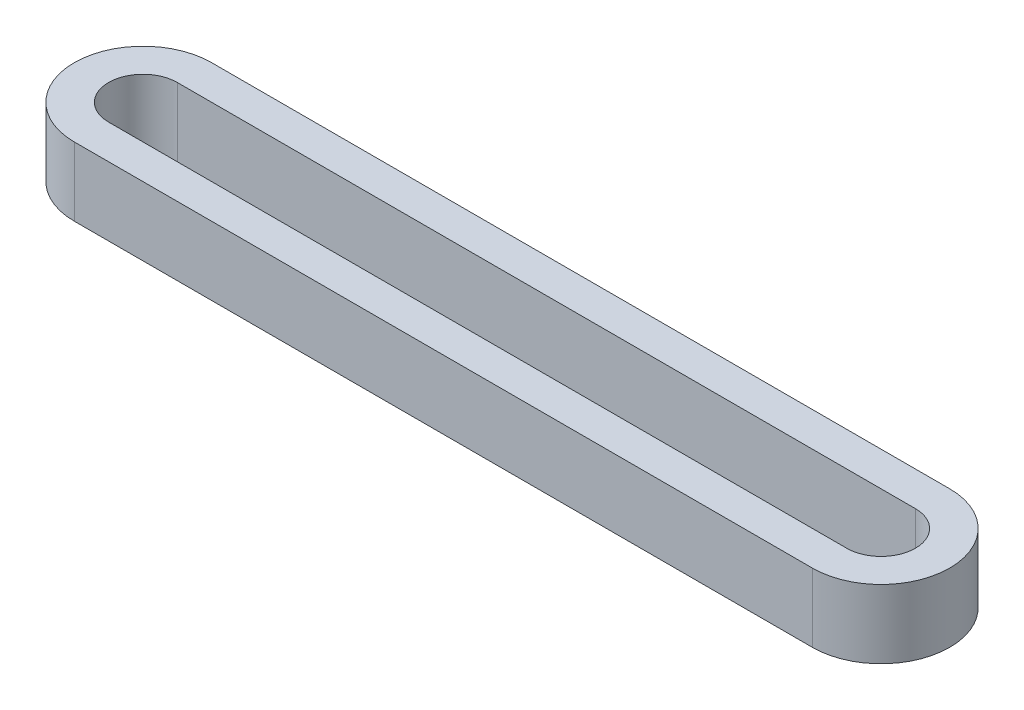
ISO-10303-21;
HEADER;
FILE_DESCRIPTION(('STEP AP214'),'2;1');
FILE_NAME('part.step','',(''),(''),'','','');
FILE_SCHEMA(('AUTOMOTIVE_DESIGN { 1 0 10303 214 1 1 1 1 }'));
ENDSEC;
DATA;
#1=APPLICATION_CONTEXT('core data for automotive mechanical design processes');
#2=APPLICATION_PROTOCOL_DEFINITION('international standard','automotive_design',2000,#1);
#3=PRODUCT_CONTEXT('',#1,'mechanical');
#4=PRODUCT('Part','Part','',(#3));
#5=PRODUCT_RELATED_PRODUCT_CATEGORY('part','',(#4));
#6=PRODUCT_DEFINITION_FORMATION('','',#4);
#7=PRODUCT_DEFINITION_CONTEXT('part definition',#1,'design');
#8=PRODUCT_DEFINITION('design','',#6,#7);
#9=PRODUCT_DEFINITION_SHAPE('','',#8);
#10=(LENGTH_UNIT() NAMED_UNIT(*) SI_UNIT(.MILLI.,.METRE.));
#11=(NAMED_UNIT(*) PLANE_ANGLE_UNIT() SI_UNIT($,.RADIAN.));
#12=(NAMED_UNIT(*) SI_UNIT($,.STERADIAN.) SOLID_ANGLE_UNIT());
#13=UNCERTAINTY_MEASURE_WITH_UNIT(LENGTH_MEASURE(1.E-05),#10,'distance_accuracy_value','');
#14=(GEOMETRIC_REPRESENTATION_CONTEXT(3) GLOBAL_UNCERTAINTY_ASSIGNED_CONTEXT((#13)) GLOBAL_UNIT_ASSIGNED_CONTEXT((#10,
#11,#12)) REPRESENTATION_CONTEXT('',''));
#15=CARTESIAN_POINT('',(0.,0.,0.));
#16=DIRECTION('',(0.,0.,1.));
#17=DIRECTION('',(1.,0.,0.));
#18=AXIS2_PLACEMENT_3D('',#15,#16,#17);
#19=CARTESIAN_POINT('',(-10.75,2.,0.));
#20=DIRECTION('',(0.,1.,0.));
#21=DIRECTION('',(0.,0.,1.));
#22=AXIS2_PLACEMENT_3D('',#19,#20,#21);
#23=PLANE('',#22);
#24=CARTESIAN_POINT('',(-10.75,2.,0.));
#25=DIRECTION('',(0.,1.,0.));
#26=DIRECTION('',(0.,0.,1.));
#27=AXIS2_PLACEMENT_3D('',#24,#25,#26);
#28=CIRCLE('',#27,2.);
#29=CARTESIAN_POINT('',(-10.75,2.,-2.));
#30=VERTEX_POINT('',#29);
#31=CARTESIAN_POINT('',(-10.75,2.,2.));
#32=VERTEX_POINT('',#31);
#33=EDGE_CURVE('E138',#30,#32,#28,.T.);
#34=ORIENTED_EDGE('',*,*,#33,.T.);
#35=DIRECTION('',(1.,0.,0.));
#36=VECTOR('',#35,1.);
#37=CARTESIAN_POINT('',(-10.75,2.,2.));
#38=LINE('',#37,#36);
#39=CARTESIAN_POINT('',(10.75,2.,2.));
#40=VERTEX_POINT('',#39);
#41=EDGE_CURVE('E141',#32,#40,#38,.T.);
#42=ORIENTED_EDGE('',*,*,#41,.T.);
#43=CARTESIAN_POINT('',(10.75,2.,0.));
#44=DIRECTION('',(0.,1.,0.));
#45=DIRECTION('',(0.,0.,1.));
#46=AXIS2_PLACEMENT_3D('',#43,#44,#45);
#47=CIRCLE('',#46,2.);
#48=CARTESIAN_POINT('',(10.75,2.,-2.00000000000001));
#49=VERTEX_POINT('',#48);
#50=EDGE_CURVE('E144',#40,#49,#47,.T.);
#51=ORIENTED_EDGE('',*,*,#50,.T.);
#52=DIRECTION('',(-1.,0.,0.));
#53=VECTOR('',#52,1.);
#54=CARTESIAN_POINT('',(-10.75,2.,-2.));
#55=LINE('',#54,#53);
#56=EDGE_CURVE('E146',#49,#30,#55,.T.);
#57=ORIENTED_EDGE('',*,*,#56,.T.);
#58=EDGE_LOOP('',(#34,#42,#51,#57));
#59=FACE_BOUND('',#58,.T.);
#60=DIRECTION('',(1.,0.,0.));
#61=VECTOR('',#60,1.);
#62=CARTESIAN_POINT('',(-10.75,2.,1.));
#63=LINE('',#62,#61);
#64=CARTESIAN_POINT('',(-10.75,2.,1.));
#65=VERTEX_POINT('',#64);
#66=CARTESIAN_POINT('',(10.75,2.,1.));
#67=VERTEX_POINT('',#66);
#68=EDGE_CURVE('E110',#65,#67,#63,.T.);
#69=ORIENTED_EDGE('',*,*,#68,.F.);
#70=CARTESIAN_POINT('',(-10.75,2.,0.));
#71=DIRECTION('',(0.,1.,0.));
#72=DIRECTION('',(0.,0.,1.));
#73=AXIS2_PLACEMENT_3D('',#70,#71,#72);
#74=CIRCLE('',#73,1.);
#75=CARTESIAN_POINT('',(-10.75,2.,-1.));
#76=VERTEX_POINT('',#75);
#77=EDGE_CURVE('E102',#76,#65,#74,.T.);
#78=ORIENTED_EDGE('',*,*,#77,.F.);
#79=DIRECTION('',(-1.,0.,0.));
#80=VECTOR('',#79,1.);
#81=CARTESIAN_POINT('',(-10.75,2.,-1.));
#82=LINE('',#81,#80);
#83=CARTESIAN_POINT('',(10.75,2.,-1.00000000000001));
#84=VERTEX_POINT('',#83);
#85=EDGE_CURVE('E124',#84,#76,#82,.T.);
#86=ORIENTED_EDGE('',*,*,#85,.F.);
#87=CARTESIAN_POINT('',(10.75,2.,0.));
#88=DIRECTION('',(0.,1.,0.));
#89=DIRECTION('',(0.,0.,1.));
#90=AXIS2_PLACEMENT_3D('',#87,#88,#89);
#91=CIRCLE('',#90,1.);
#92=EDGE_CURVE('E122',#67,#84,#91,.T.);
#93=ORIENTED_EDGE('',*,*,#92,.F.);
#94=EDGE_LOOP('',(#69,#78,#86,#93));
#95=FACE_BOUND('',#94,.T.);
#96=ADVANCED_FACE('F37',(#59,#95),#23,.T.);
#97=CARTESIAN_POINT('',(-10.75,0.,0.));
#98=DIRECTION('',(0.,1.,0.));
#99=DIRECTION('',(0.,0.,1.));
#100=AXIS2_PLACEMENT_3D('',#97,#98,#99);
#101=PLANE('',#100);
#102=CARTESIAN_POINT('',(-10.75,0.,0.));
#103=DIRECTION('',(0.,1.,0.));
#104=DIRECTION('',(0.,0.,1.));
#105=AXIS2_PLACEMENT_3D('',#102,#103,#104);
#106=CIRCLE('',#105,2.);
#107=CARTESIAN_POINT('',(-10.75,0.,-2.));
#108=VERTEX_POINT('',#107);
#109=CARTESIAN_POINT('',(-10.75,0.,2.));
#110=VERTEX_POINT('',#109);
#111=EDGE_CURVE('E118',#108,#110,#106,.T.);
#112=ORIENTED_EDGE('',*,*,#111,.F.);
#113=DIRECTION('',(-1.,0.,0.));
#114=VECTOR('',#113,1.);
#115=CARTESIAN_POINT('',(-10.75,0.,-2.));
#116=LINE('',#115,#114);
#117=CARTESIAN_POINT('',(10.75,0.,-2.00000000000001));
#118=VERTEX_POINT('',#117);
#119=EDGE_CURVE('E142',#118,#108,#116,.T.);
#120=ORIENTED_EDGE('',*,*,#119,.F.);
#121=CARTESIAN_POINT('',(10.75,0.,0.));
#122=DIRECTION('',(0.,1.,0.));
#123=DIRECTION('',(0.,0.,1.));
#124=AXIS2_PLACEMENT_3D('',#121,#122,#123);
#125=CIRCLE('',#124,2.);
#126=CARTESIAN_POINT('',(10.75,0.,2.));
#127=VERTEX_POINT('',#126);
#128=EDGE_CURVE('E153',#127,#118,#125,.T.);
#129=ORIENTED_EDGE('',*,*,#128,.F.);
#130=DIRECTION('',(1.,0.,0.));
#131=VECTOR('',#130,1.);
#132=CARTESIAN_POINT('',(-10.75,0.,2.));
#133=LINE('',#132,#131);
#134=EDGE_CURVE('E151',#110,#127,#133,.T.);
#135=ORIENTED_EDGE('',*,*,#134,.F.);
#136=EDGE_LOOP('',(#112,#120,#129,#135));
#137=FACE_BOUND('',#136,.T.);
#138=CARTESIAN_POINT('',(-10.75,0.,0.));
#139=DIRECTION('',(0.,1.,0.));
#140=DIRECTION('',(0.,0.,1.));
#141=AXIS2_PLACEMENT_3D('',#138,#139,#140);
#142=CIRCLE('',#141,1.);
#143=CARTESIAN_POINT('',(-10.75,0.,-1.));
#144=VERTEX_POINT('',#143);
#145=CARTESIAN_POINT('',(-10.75,0.,1.));
#146=VERTEX_POINT('',#145);
#147=EDGE_CURVE('E60',#144,#146,#142,.T.);
#148=ORIENTED_EDGE('',*,*,#147,.T.);
#149=DIRECTION('',(1.,0.,0.));
#150=VECTOR('',#149,1.);
#151=CARTESIAN_POINT('',(-10.75,0.,1.));
#152=LINE('',#151,#150);
#153=CARTESIAN_POINT('',(10.75,0.,1.));
#154=VERTEX_POINT('',#153);
#155=EDGE_CURVE('E117',#146,#154,#152,.T.);
#156=ORIENTED_EDGE('',*,*,#155,.T.);
#157=CARTESIAN_POINT('',(10.75,0.,0.));
#158=DIRECTION('',(0.,1.,0.));
#159=DIRECTION('',(0.,0.,1.));
#160=AXIS2_PLACEMENT_3D('',#157,#158,#159);
#161=CIRCLE('',#160,1.);
#162=CARTESIAN_POINT('',(10.75,0.,-1.00000000000001));
#163=VERTEX_POINT('',#162);
#164=EDGE_CURVE('E130',#154,#163,#161,.T.);
#165=ORIENTED_EDGE('',*,*,#164,.T.);
#166=DIRECTION('',(-1.,0.,0.));
#167=VECTOR('',#166,1.);
#168=CARTESIAN_POINT('',(-10.75,0.,-1.));
#169=LINE('',#168,#167);
#170=EDGE_CURVE('E111',#163,#144,#169,.T.);
#171=ORIENTED_EDGE('',*,*,#170,.T.);
#172=EDGE_LOOP('',(#148,#156,#165,#171));
#173=FACE_BOUND('',#172,.T.);
#174=ADVANCED_FACE('F171',(#137,#173),#101,.F.);
#175=CARTESIAN_POINT('',(-10.75,2.,0.));
#176=DIRECTION('',(0.,-1.,0.));
#177=DIRECTION('',(0.,0.,-1.));
#178=AXIS2_PLACEMENT_3D('',#175,#176,#177);
#179=CYLINDRICAL_SURFACE('',#178,2.);
#180=ORIENTED_EDGE('',*,*,#111,.T.);
#181=DIRECTION('',(0.,-1.,0.));
#182=VECTOR('',#181,1.);
#183=CARTESIAN_POINT('',(-10.75,2.,2.));
#184=LINE('',#183,#182);
#185=EDGE_CURVE('E11',#32,#110,#184,.T.);
#186=ORIENTED_EDGE('',*,*,#185,.F.);
#187=ORIENTED_EDGE('',*,*,#33,.F.);
#188=DIRECTION('',(0.,-1.,0.));
#189=VECTOR('',#188,1.);
#190=CARTESIAN_POINT('',(-10.75,2.,-2.));
#191=LINE('',#190,#189);
#192=EDGE_CURVE('E148',#30,#108,#191,.T.);
#193=ORIENTED_EDGE('',*,*,#192,.T.);
#194=EDGE_LOOP('',(#180,#186,#187,#193));
#195=FACE_BOUND('',#194,.T.);
#196=ADVANCED_FACE('F39',(#195),#179,.T.);
#197=CARTESIAN_POINT('',(-10.75,2.,2.));
#198=DIRECTION('',(0.,0.,-1.));
#199=DIRECTION('',(-1.,0.,0.));
#200=AXIS2_PLACEMENT_3D('',#197,#198,#199);
#201=PLANE('',#200);
#202=ORIENTED_EDGE('',*,*,#134,.T.);
#203=DIRECTION('',(0.,-1.,0.));
#204=VECTOR('',#203,1.);
#205=CARTESIAN_POINT('',(10.75,2.,2.));
#206=LINE('',#205,#204);
#207=EDGE_CURVE('E45',#40,#127,#206,.T.);
#208=ORIENTED_EDGE('',*,*,#207,.F.);
#209=ORIENTED_EDGE('',*,*,#41,.F.);
#210=ORIENTED_EDGE('',*,*,#185,.T.);
#211=EDGE_LOOP('',(#202,#208,#209,#210));
#212=FACE_BOUND('',#211,.T.);
#213=ADVANCED_FACE('F181',(#212),#201,.F.);
#214=CARTESIAN_POINT('',(10.75,2.,0.));
#215=DIRECTION('',(0.,-1.,0.));
#216=DIRECTION('',(0.,0.,-1.));
#217=AXIS2_PLACEMENT_3D('',#214,#215,#216);
#218=CYLINDRICAL_SURFACE('',#217,2.);
#219=ORIENTED_EDGE('',*,*,#128,.T.);
#220=DIRECTION('',(0.,-1.,0.));
#221=VECTOR('',#220,1.);
#222=CARTESIAN_POINT('',(10.75,2.,-2.00000000000001));
#223=LINE('',#222,#221);
#224=EDGE_CURVE('E158',#49,#118,#223,.T.);
#225=ORIENTED_EDGE('',*,*,#224,.F.);
#226=ORIENTED_EDGE('',*,*,#50,.F.);
#227=ORIENTED_EDGE('',*,*,#207,.T.);
#228=EDGE_LOOP('',(#219,#225,#226,#227));
#229=FACE_BOUND('',#228,.T.);
#230=ADVANCED_FACE('F165',(#229),#218,.T.);
#231=CARTESIAN_POINT('',(-10.75,2.,-2.));
#232=DIRECTION('',(0.,0.,1.));
#233=DIRECTION('',(1.,0.,0.));
#234=AXIS2_PLACEMENT_3D('',#231,#232,#233);
#235=PLANE('',#234);
#236=ORIENTED_EDGE('',*,*,#119,.T.);
#237=ORIENTED_EDGE('',*,*,#192,.F.);
#238=ORIENTED_EDGE('',*,*,#56,.F.);
#239=ORIENTED_EDGE('',*,*,#224,.T.);
#240=EDGE_LOOP('',(#236,#237,#238,#239));
#241=FACE_BOUND('',#240,.T.);
#242=ADVANCED_FACE('F175',(#241),#235,.F.);
#243=CARTESIAN_POINT('',(-10.75,2.,0.));
#244=DIRECTION('',(0.,-1.,0.));
#245=DIRECTION('',(0.,0.,-1.));
#246=AXIS2_PLACEMENT_3D('',#243,#244,#245);
#247=CYLINDRICAL_SURFACE('',#246,1.);
#248=ORIENTED_EDGE('',*,*,#147,.F.);
#249=DIRECTION('',(0.,-1.,0.));
#250=VECTOR('',#249,1.);
#251=CARTESIAN_POINT('',(-10.75,2.,-1.));
#252=LINE('',#251,#250);
#253=EDGE_CURVE('E106',#76,#144,#252,.T.);
#254=ORIENTED_EDGE('',*,*,#253,.F.);
#255=ORIENTED_EDGE('',*,*,#77,.T.);
#256=DIRECTION('',(0.,-1.,0.));
#257=VECTOR('',#256,1.);
#258=CARTESIAN_POINT('',(-10.75,2.,1.));
#259=LINE('',#258,#257);
#260=EDGE_CURVE('E105',#65,#146,#259,.T.);
#261=ORIENTED_EDGE('',*,*,#260,.T.);
#262=EDGE_LOOP('',(#248,#254,#255,#261));
#263=FACE_BOUND('',#262,.T.);
#264=ADVANCED_FACE('F104',(#263),#247,.F.);
#265=CARTESIAN_POINT('',(-10.75,2.,1.));
#266=DIRECTION('',(0.,0.,-1.));
#267=DIRECTION('',(-1.,0.,0.));
#268=AXIS2_PLACEMENT_3D('',#265,#266,#267);
#269=PLANE('',#268);
#270=ORIENTED_EDGE('',*,*,#155,.F.);
#271=ORIENTED_EDGE('',*,*,#260,.F.);
#272=ORIENTED_EDGE('',*,*,#68,.T.);
#273=DIRECTION('',(0.,-1.,0.));
#274=VECTOR('',#273,1.);
#275=CARTESIAN_POINT('',(10.75,2.,1.));
#276=LINE('',#275,#274);
#277=EDGE_CURVE('E119',#67,#154,#276,.T.);
#278=ORIENTED_EDGE('',*,*,#277,.T.);
#279=EDGE_LOOP('',(#270,#271,#272,#278));
#280=FACE_BOUND('',#279,.T.);
#281=ADVANCED_FACE('F114',(#280),#269,.T.);
#282=CARTESIAN_POINT('',(10.75,2.,0.));
#283=DIRECTION('',(0.,-1.,0.));
#284=DIRECTION('',(0.,0.,-1.));
#285=AXIS2_PLACEMENT_3D('',#282,#283,#284);
#286=CYLINDRICAL_SURFACE('',#285,1.);
#287=ORIENTED_EDGE('',*,*,#164,.F.);
#288=ORIENTED_EDGE('',*,*,#277,.F.);
#289=ORIENTED_EDGE('',*,*,#92,.T.);
#290=DIRECTION('',(0.,-1.,0.));
#291=VECTOR('',#290,1.);
#292=CARTESIAN_POINT('',(10.75,2.,-1.00000000000001));
#293=LINE('',#292,#291);
#294=EDGE_CURVE('E52',#84,#163,#293,.T.);
#295=ORIENTED_EDGE('',*,*,#294,.T.);
#296=EDGE_LOOP('',(#287,#288,#289,#295));
#297=FACE_BOUND('',#296,.T.);
#298=ADVANCED_FACE('F204',(#297),#286,.F.);
#299=CARTESIAN_POINT('',(-10.75,2.,-1.));
#300=DIRECTION('',(0.,0.,1.));
#301=DIRECTION('',(1.,0.,0.));
#302=AXIS2_PLACEMENT_3D('',#299,#300,#301);
#303=PLANE('',#302);
#304=ORIENTED_EDGE('',*,*,#170,.F.);
#305=ORIENTED_EDGE('',*,*,#294,.F.);
#306=ORIENTED_EDGE('',*,*,#85,.T.);
#307=ORIENTED_EDGE('',*,*,#253,.T.);
#308=EDGE_LOOP('',(#304,#305,#306,#307));
#309=FACE_BOUND('',#308,.T.);
#310=ADVANCED_FACE('F208',(#309),#303,.T.);
#311=CLOSED_SHELL('',(#96,#174,#196,#213,#230,#242,#264,#281,#298,#310));
#312=MANIFOLD_SOLID_BREP('B2',#311);
#313=ADVANCED_BREP_SHAPE_REPRESENTATION('',(#18,#312),#14);
#314=SHAPE_DEFINITION_REPRESENTATION(#9,#313);
ENDSEC;
END-ISO-10303-21;
